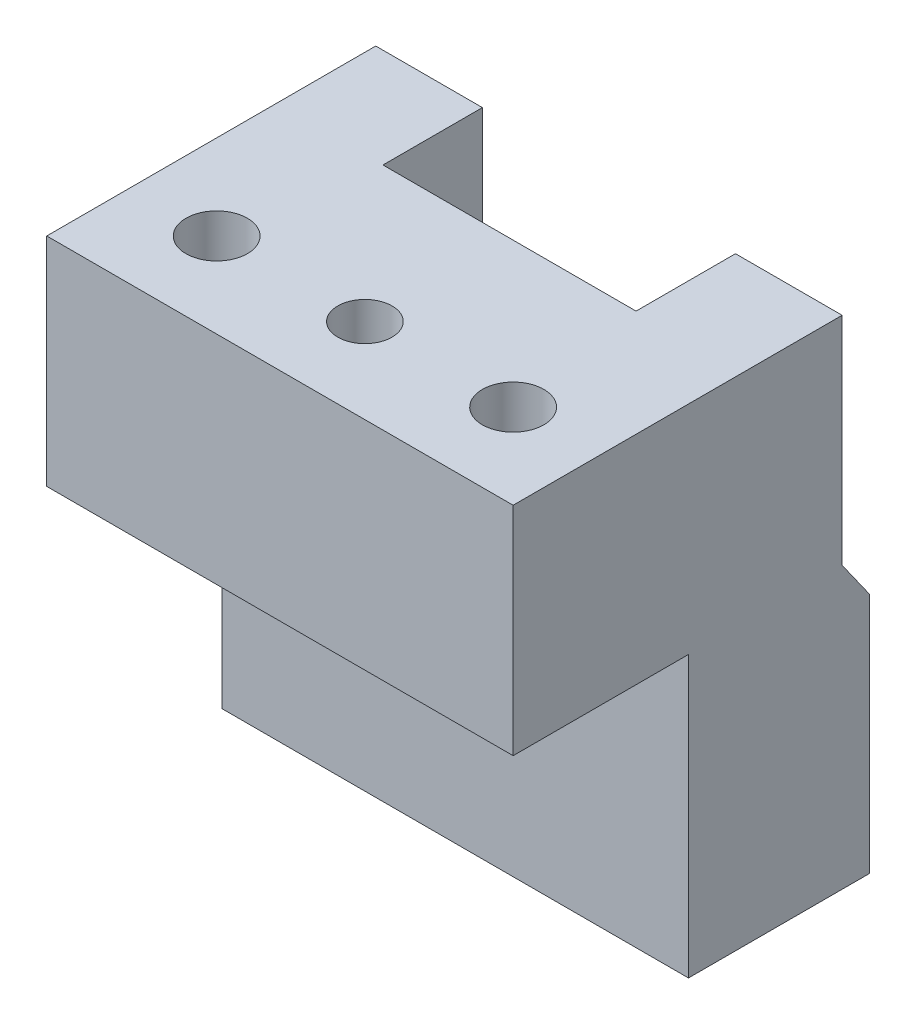
ISO-10303-21;
HEADER;
FILE_DESCRIPTION(('STEP AP214'),'2;1');
FILE_NAME('part.step','',(''),(''),'','','');
FILE_SCHEMA(('AUTOMOTIVE_DESIGN { 1 0 10303 214 1 1 1 1 }'));
ENDSEC;
DATA;
#1=APPLICATION_CONTEXT('core data for automotive mechanical design processes');
#2=APPLICATION_PROTOCOL_DEFINITION('international standard','automotive_design',2000,#1);
#3=PRODUCT_CONTEXT('',#1,'mechanical');
#4=PRODUCT('Part','Part','',(#3));
#5=PRODUCT_RELATED_PRODUCT_CATEGORY('part','',(#4));
#6=PRODUCT_DEFINITION_FORMATION('','',#4);
#7=PRODUCT_DEFINITION_CONTEXT('part definition',#1,'design');
#8=PRODUCT_DEFINITION('design','',#6,#7);
#9=PRODUCT_DEFINITION_SHAPE('','',#8);
#10=(LENGTH_UNIT() NAMED_UNIT(*) SI_UNIT(.MILLI.,.METRE.));
#11=(NAMED_UNIT(*) PLANE_ANGLE_UNIT() SI_UNIT($,.RADIAN.));
#12=(NAMED_UNIT(*) SI_UNIT($,.STERADIAN.) SOLID_ANGLE_UNIT());
#13=UNCERTAINTY_MEASURE_WITH_UNIT(LENGTH_MEASURE(1.E-05),#10,'distance_accuracy_value','');
#14=(GEOMETRIC_REPRESENTATION_CONTEXT(3) GLOBAL_UNCERTAINTY_ASSIGNED_CONTEXT((#13)) GLOBAL_UNIT_ASSIGNED_CONTEXT((#10,
#11,#12)) REPRESENTATION_CONTEXT('',''));
#15=CARTESIAN_POINT('',(0.,0.,0.));
#16=DIRECTION('',(0.,0.,1.));
#17=DIRECTION('',(1.,0.,0.));
#18=AXIS2_PLACEMENT_3D('',#15,#16,#17);
#19=CARTESIAN_POINT('',(0.,0.,0.));
#20=DIRECTION('',(0.,1.,0.));
#21=DIRECTION('',(0.,0.,1.));
#22=AXIS2_PLACEMENT_3D('',#19,#20,#21);
#23=PLANE('',#22);
#24=CARTESIAN_POINT('',(21.1,0.,-4.7));
#25=DIRECTION('',(0.,1.,0.));
#26=DIRECTION('',(0.,0.,1.));
#27=AXIS2_PLACEMENT_3D('',#24,#25,#26);
#28=CIRCLE('',#27,1.7);
#29=CARTESIAN_POINT('',(21.1,0.,-3.));
#30=VERTEX_POINT('',#29);
#31=EDGE_CURVE('E235',#30,#30,#28,.T.);
#32=ORIENTED_EDGE('',*,*,#31,.T.);
#33=EDGE_LOOP('',(#32));
#34=FACE_BOUND('',#33,.T.);
#35=CARTESIAN_POINT('',(12.9,0.,-4.7));
#36=DIRECTION('',(0.,1.,0.));
#37=DIRECTION('',(0.,0.,1.));
#38=AXIS2_PLACEMENT_3D('',#35,#36,#37);
#39=CIRCLE('',#38,1.5);
#40=CARTESIAN_POINT('',(12.9,0.,-3.2));
#41=VERTEX_POINT('',#40);
#42=EDGE_CURVE('E339',#41,#41,#39,.T.);
#43=ORIENTED_EDGE('',*,*,#42,.T.);
#44=EDGE_LOOP('',(#43));
#45=FACE_BOUND('',#44,.T.);
#46=CARTESIAN_POINT('',(4.7,0.,-4.7));
#47=DIRECTION('',(0.,1.,0.));
#48=DIRECTION('',(0.,0.,1.));
#49=AXIS2_PLACEMENT_3D('',#46,#47,#48);
#50=CIRCLE('',#49,1.7);
#51=CARTESIAN_POINT('',(4.7,0.,-3.));
#52=VERTEX_POINT('',#51);
#53=EDGE_CURVE('E333',#52,#52,#50,.T.);
#54=ORIENTED_EDGE('',*,*,#53,.T.);
#55=EDGE_LOOP('',(#54));
#56=FACE_BOUND('',#55,.T.);
#57=DIRECTION('',(-1.,0.,0.));
#58=VECTOR('',#57,1.);
#59=CARTESIAN_POINT('',(25.8,0.,-9.7));
#60=LINE('',#59,#58);
#61=CARTESIAN_POINT('',(25.8,0.,-9.7));
#62=VERTEX_POINT('',#61);
#63=CARTESIAN_POINT('',(0.,0.,-9.7));
#64=VERTEX_POINT('',#63);
#65=EDGE_CURVE('E200',#62,#64,#60,.T.);
#66=ORIENTED_EDGE('',*,*,#65,.F.);
#67=DIRECTION('',(0.,0.,-1.));
#68=VECTOR('',#67,1.);
#69=CARTESIAN_POINT('',(25.8,0.,0.));
#70=LINE('',#69,#68);
#71=CARTESIAN_POINT('',(25.8,0.,0.));
#72=VERTEX_POINT('',#71);
#73=EDGE_CURVE('E225',#72,#62,#70,.T.);
#74=ORIENTED_EDGE('',*,*,#73,.F.);
#75=DIRECTION('',(1.,0.,0.));
#76=VECTOR('',#75,1.);
#77=CARTESIAN_POINT('',(0.,0.,0.));
#78=LINE('',#77,#76);
#79=CARTESIAN_POINT('',(0.,0.,0.));
#80=VERTEX_POINT('',#79);
#81=EDGE_CURVE('E293',#80,#72,#78,.T.);
#82=ORIENTED_EDGE('',*,*,#81,.F.);
#83=DIRECTION('',(0.,0.,1.));
#84=VECTOR('',#83,1.);
#85=CARTESIAN_POINT('',(0.,0.,-18.2));
#86=LINE('',#85,#84);
#87=EDGE_CURVE('E279',#64,#80,#86,.T.);
#88=ORIENTED_EDGE('',*,*,#87,.F.);
#89=EDGE_LOOP('',(#66,#74,#82,#88));
#90=FACE_BOUND('',#89,.T.);
#91=ADVANCED_FACE('F32',(#34,#45,#56,#90),#23,.F.);
#92=CARTESIAN_POINT('',(0.,12.,0.));
#93=DIRECTION('',(0.,1.,0.));
#94=DIRECTION('',(0.,0.,1.));
#95=AXIS2_PLACEMENT_3D('',#92,#93,#94);
#96=PLANE('',#95);
#97=CARTESIAN_POINT('',(12.9,12.,-4.7));
#98=DIRECTION('',(0.,1.,0.));
#99=DIRECTION('',(0.,0.,1.));
#100=AXIS2_PLACEMENT_3D('',#97,#98,#99);
#101=CIRCLE('',#100,1.5);
#102=CARTESIAN_POINT('',(12.9,12.,-3.2));
#103=VERTEX_POINT('',#102);
#104=EDGE_CURVE('E336',#103,#103,#101,.T.);
#105=ORIENTED_EDGE('',*,*,#104,.F.);
#106=EDGE_LOOP('',(#105));
#107=FACE_BOUND('',#106,.T.);
#108=DIRECTION('',(0.,0.,1.));
#109=VECTOR('',#108,1.);
#110=CARTESIAN_POINT('',(0.,12.,-18.2));
#111=LINE('',#110,#109);
#112=CARTESIAN_POINT('',(0.,12.,-18.2));
#113=VERTEX_POINT('',#112);
#114=CARTESIAN_POINT('',(0.,12.,0.));
#115=VERTEX_POINT('',#114);
#116=EDGE_CURVE('E292',#113,#115,#111,.T.);
#117=ORIENTED_EDGE('',*,*,#116,.T.);
#118=DIRECTION('',(1.,0.,0.));
#119=VECTOR('',#118,1.);
#120=CARTESIAN_POINT('',(0.,12.,0.));
#121=LINE('',#120,#119);
#122=CARTESIAN_POINT('',(25.8,12.,0.));
#123=VERTEX_POINT('',#122);
#124=EDGE_CURVE('E295',#115,#123,#121,.T.);
#125=ORIENTED_EDGE('',*,*,#124,.T.);
#126=DIRECTION('',(0.,0.,-1.));
#127=VECTOR('',#126,1.);
#128=CARTESIAN_POINT('',(25.8,12.,0.));
#129=LINE('',#128,#127);
#130=CARTESIAN_POINT('',(25.8,12.,-18.2));
#131=VERTEX_POINT('',#130);
#132=EDGE_CURVE('E330',#123,#131,#129,.T.);
#133=ORIENTED_EDGE('',*,*,#132,.T.);
#134=DIRECTION('',(-1.,0.,0.));
#135=VECTOR('',#134,1.);
#136=CARTESIAN_POINT('',(19.9,12.,-18.2));
#137=LINE('',#136,#135);
#138=CARTESIAN_POINT('',(19.9,12.,-18.2));
#139=VERTEX_POINT('',#138);
#140=EDGE_CURVE('E328',#131,#139,#137,.T.);
#141=ORIENTED_EDGE('',*,*,#140,.T.);
#142=DIRECTION('',(0.,0.,1.));
#143=VECTOR('',#142,1.);
#144=CARTESIAN_POINT('',(19.9,12.,-18.2));
#145=LINE('',#144,#143);
#146=CARTESIAN_POINT('',(19.9,12.,-12.7));
#147=VERTEX_POINT('',#146);
#148=EDGE_CURVE('E326',#139,#147,#145,.T.);
#149=ORIENTED_EDGE('',*,*,#148,.T.);
#150=DIRECTION('',(-1.,0.,0.));
#151=VECTOR('',#150,1.);
#152=CARTESIAN_POINT('',(19.9,12.,-12.7));
#153=LINE('',#152,#151);
#154=CARTESIAN_POINT('',(5.9,12.,-12.7));
#155=VERTEX_POINT('',#154);
#156=EDGE_CURVE('E322',#147,#155,#153,.T.);
#157=ORIENTED_EDGE('',*,*,#156,.T.);
#158=DIRECTION('',(0.,0.,-1.));
#159=VECTOR('',#158,1.);
#160=CARTESIAN_POINT('',(5.9,12.,-12.7));
#161=LINE('',#160,#159);
#162=CARTESIAN_POINT('',(5.9,12.,-18.2));
#163=VERTEX_POINT('',#162);
#164=EDGE_CURVE('E321',#155,#163,#161,.T.);
#165=ORIENTED_EDGE('',*,*,#164,.T.);
#166=DIRECTION('',(-1.,0.,0.));
#167=VECTOR('',#166,1.);
#168=CARTESIAN_POINT('',(0.,12.,-18.2));
#169=LINE('',#168,#167);
#170=EDGE_CURVE('E256',#163,#113,#169,.T.);
#171=ORIENTED_EDGE('',*,*,#170,.T.);
#172=EDGE_LOOP('',(#117,#125,#133,#141,#149,#157,#165,#171));
#173=FACE_BOUND('',#172,.T.);
#174=CARTESIAN_POINT('',(4.7,12.,-4.7));
#175=DIRECTION('',(0.,1.,0.));
#176=DIRECTION('',(0.,0.,1.));
#177=AXIS2_PLACEMENT_3D('',#174,#175,#176);
#178=CIRCLE('',#177,1.7);
#179=CARTESIAN_POINT('',(4.7,12.,-3.));
#180=VERTEX_POINT('',#179);
#181=EDGE_CURVE('E300',#180,#180,#178,.T.);
#182=ORIENTED_EDGE('',*,*,#181,.F.);
#183=EDGE_LOOP('',(#182));
#184=FACE_BOUND('',#183,.T.);
#185=CARTESIAN_POINT('',(21.1,12.,-4.7));
#186=DIRECTION('',(0.,1.,0.));
#187=DIRECTION('',(0.,0.,1.));
#188=AXIS2_PLACEMENT_3D('',#185,#186,#187);
#189=CIRCLE('',#188,1.7);
#190=CARTESIAN_POINT('',(21.1,12.,-3.));
#191=VERTEX_POINT('',#190);
#192=EDGE_CURVE('E219',#191,#191,#189,.T.);
#193=ORIENTED_EDGE('',*,*,#192,.F.);
#194=EDGE_LOOP('',(#193));
#195=FACE_BOUND('',#194,.T.);
#196=ADVANCED_FACE('F319',(#107,#173,#184,#195),#96,.T.);
#197=CARTESIAN_POINT('',(0.,12.,-18.2));
#198=DIRECTION('',(1.,0.,0.));
#199=DIRECTION('',(0.,0.,-1.));
#200=AXIS2_PLACEMENT_3D('',#197,#198,#199);
#201=PLANE('',#200);
#202=DIRECTION('',(0.,-1.,0.));
#203=VECTOR('',#202,1.);
#204=CARTESIAN_POINT('',(0.,12.,-18.2));
#205=LINE('',#204,#203);
#206=CARTESIAN_POINT('',(0.,0.0213203435597605,-18.2));
#207=VERTEX_POINT('',#206);
#208=EDGE_CURVE('E258',#113,#207,#205,.T.);
#209=ORIENTED_EDGE('',*,*,#208,.T.);
#210=DIRECTION('',(0.,-0.816496580927723,-0.57735026918963));
#211=VECTOR('',#210,1.);
#212=CARTESIAN_POINT('',(0.,8.00710678118654,-12.5531962568465));
#213=LINE('',#212,#211);
#214=CARTESIAN_POINT('',(0.,-2.09999999999989,-19.7));
#215=VERTEX_POINT('',#214);
#216=EDGE_CURVE('E11',#207,#215,#213,.T.);
#217=ORIENTED_EDGE('',*,*,#216,.T.);
#218=DIRECTION('',(0.,-1.,0.));
#219=VECTOR('',#218,1.);
#220=CARTESIAN_POINT('',(0.,-12.5,-19.7));
#221=LINE('',#220,#219);
#222=CARTESIAN_POINT('',(0.,-15.5,-19.7));
#223=VERTEX_POINT('',#222);
#224=EDGE_CURVE('E181',#215,#223,#221,.T.);
#225=ORIENTED_EDGE('',*,*,#224,.T.);
#226=DIRECTION('',(0.,0.,-1.));
#227=VECTOR('',#226,1.);
#228=CARTESIAN_POINT('',(0.,-15.5,-9.7));
#229=LINE('',#228,#227);
#230=CARTESIAN_POINT('',(0.,-15.5,-9.7));
#231=VERTEX_POINT('',#230);
#232=EDGE_CURVE('E205',#231,#223,#229,.T.);
#233=ORIENTED_EDGE('',*,*,#232,.F.);
#234=DIRECTION('',(0.,1.,0.));
#235=VECTOR('',#234,1.);
#236=CARTESIAN_POINT('',(0.,-15.5,-9.7));
#237=LINE('',#236,#235);
#238=EDGE_CURVE('E216',#231,#64,#237,.T.);
#239=ORIENTED_EDGE('',*,*,#238,.T.);
#240=ORIENTED_EDGE('',*,*,#87,.T.);
#241=DIRECTION('',(0.,-1.,0.));
#242=VECTOR('',#241,1.);
#243=CARTESIAN_POINT('',(0.,12.,0.));
#244=LINE('',#243,#242);
#245=EDGE_CURVE('E240',#115,#80,#244,.T.);
#246=ORIENTED_EDGE('',*,*,#245,.F.);
#247=ORIENTED_EDGE('',*,*,#116,.F.);
#248=EDGE_LOOP('',(#209,#217,#225,#233,#239,#240,#246,#247));
#249=FACE_BOUND('',#248,.T.);
#250=ADVANCED_FACE('F264',(#249),#201,.F.);
#251=CARTESIAN_POINT('',(0.,12.,0.));
#252=DIRECTION('',(0.,0.,-1.));
#253=DIRECTION('',(-1.,0.,0.));
#254=AXIS2_PLACEMENT_3D('',#251,#252,#253);
#255=PLANE('',#254);
#256=ORIENTED_EDGE('',*,*,#81,.T.);
#257=DIRECTION('',(0.,-1.,0.));
#258=VECTOR('',#257,1.);
#259=CARTESIAN_POINT('',(25.8,12.,0.));
#260=LINE('',#259,#258);
#261=EDGE_CURVE('E291',#123,#72,#260,.T.);
#262=ORIENTED_EDGE('',*,*,#261,.F.);
#263=ORIENTED_EDGE('',*,*,#124,.F.);
#264=ORIENTED_EDGE('',*,*,#245,.T.);
#265=EDGE_LOOP('',(#256,#262,#263,#264));
#266=FACE_BOUND('',#265,.T.);
#267=ADVANCED_FACE('F317',(#266),#255,.F.);
#268=CARTESIAN_POINT('',(25.8,12.,0.));
#269=DIRECTION('',(-1.,0.,0.));
#270=DIRECTION('',(0.,0.,1.));
#271=AXIS2_PLACEMENT_3D('',#268,#269,#270);
#272=PLANE('',#271);
#273=ORIENTED_EDGE('',*,*,#73,.T.);
#274=DIRECTION('',(0.,1.,0.));
#275=VECTOR('',#274,1.);
#276=CARTESIAN_POINT('',(25.8,-15.5,-9.7));
#277=LINE('',#276,#275);
#278=CARTESIAN_POINT('',(25.8,-15.5,-9.7));
#279=VERTEX_POINT('',#278);
#280=EDGE_CURVE('E230',#279,#62,#277,.T.);
#281=ORIENTED_EDGE('',*,*,#280,.F.);
#282=DIRECTION('',(0.,0.,1.));
#283=VECTOR('',#282,1.);
#284=CARTESIAN_POINT('',(25.8,-15.5,-18.2));
#285=LINE('',#284,#283);
#286=CARTESIAN_POINT('',(25.8,-15.5,-19.7));
#287=VERTEX_POINT('',#286);
#288=EDGE_CURVE('E201',#287,#279,#285,.T.);
#289=ORIENTED_EDGE('',*,*,#288,.F.);
#290=DIRECTION('',(0.,-1.,0.));
#291=VECTOR('',#290,1.);
#292=CARTESIAN_POINT('',(25.8,-12.5,-19.7));
#293=LINE('',#292,#291);
#294=CARTESIAN_POINT('',(25.8,-2.09999999999989,-19.7));
#295=VERTEX_POINT('',#294);
#296=EDGE_CURVE('E191',#295,#287,#293,.T.);
#297=ORIENTED_EDGE('',*,*,#296,.F.);
#298=DIRECTION('',(0.,0.816496580927724,0.577350269189629));
#299=VECTOR('',#298,1.);
#300=CARTESIAN_POINT('',(25.8,16.5866690595833,-6.48652959017977));
#301=LINE('',#300,#299);
#302=CARTESIAN_POINT('',(25.8,0.0213203435597657,-18.2));
#303=VERTEX_POINT('',#302);
#304=EDGE_CURVE('E244',#295,#303,#301,.T.);
#305=ORIENTED_EDGE('',*,*,#304,.T.);
#306=DIRECTION('',(0.,-1.,0.));
#307=VECTOR('',#306,1.);
#308=CARTESIAN_POINT('',(25.8,12.,-18.2));
#309=LINE('',#308,#307);
#310=EDGE_CURVE('E313',#131,#303,#309,.T.);
#311=ORIENTED_EDGE('',*,*,#310,.F.);
#312=ORIENTED_EDGE('',*,*,#132,.F.);
#313=ORIENTED_EDGE('',*,*,#261,.T.);
#314=EDGE_LOOP('',(#273,#281,#289,#297,#305,#311,#312,#313));
#315=FACE_BOUND('',#314,.T.);
#316=ADVANCED_FACE('F288',(#315),#272,.F.);
#317=CARTESIAN_POINT('',(19.9,12.,-18.2));
#318=DIRECTION('',(0.,0.,1.));
#319=DIRECTION('',(1.,0.,0.));
#320=AXIS2_PLACEMENT_3D('',#317,#318,#319);
#321=PLANE('',#320);
#322=ORIENTED_EDGE('',*,*,#310,.T.);
#323=DIRECTION('',(-0.707106781186544,-0.707106781186551,0.));
#324=VECTOR('',#323,1.);
#325=CARTESIAN_POINT('',(28.8393398282202,3.06066017177994,-18.2));
#326=LINE('',#325,#324);
#327=CARTESIAN_POINT('',(19.9,-5.87867965644031,-18.2));
#328=VERTEX_POINT('',#327);
#329=EDGE_CURVE('E239',#303,#328,#326,.T.);
#330=ORIENTED_EDGE('',*,*,#329,.T.);
#331=DIRECTION('',(0.,-1.,0.));
#332=VECTOR('',#331,1.);
#333=CARTESIAN_POINT('',(19.9,12.,-18.2));
#334=LINE('',#333,#332);
#335=EDGE_CURVE('E310',#139,#328,#334,.T.);
#336=ORIENTED_EDGE('',*,*,#335,.F.);
#337=ORIENTED_EDGE('',*,*,#140,.F.);
#338=EDGE_LOOP('',(#322,#330,#336,#337));
#339=FACE_BOUND('',#338,.T.);
#340=ADVANCED_FACE('F377',(#339),#321,.F.);
#341=CARTESIAN_POINT('',(19.9,12.,-18.2));
#342=DIRECTION('',(1.,0.,0.));
#343=DIRECTION('',(0.,0.,-1.));
#344=AXIS2_PLACEMENT_3D('',#341,#342,#343);
#345=PLANE('',#344);
#346=ORIENTED_EDGE('',*,*,#335,.T.);
#347=DIRECTION('',(0.,-0.816496580927724,-0.577350269189629));
#348=VECTOR('',#347,1.);
#349=CARTESIAN_POINT('',(19.9,6.04044011451984,-9.77190958417937));
#350=LINE('',#349,#348);
#351=CARTESIAN_POINT('',(19.9,-7.99999999999996,-19.7));
#352=VERTEX_POINT('',#351);
#353=EDGE_CURVE('E246',#328,#352,#350,.T.);
#354=ORIENTED_EDGE('',*,*,#353,.T.);
#355=DIRECTION('',(0.,0.,-1.));
#356=VECTOR('',#355,1.);
#357=CARTESIAN_POINT('',(19.9,-7.99999999999995,-3.49217895131971));
#358=LINE('',#357,#356);
#359=CARTESIAN_POINT('',(19.9,-7.99999999999995,-18.2));
#360=VERTEX_POINT('',#359);
#361=EDGE_CURVE('E47',#360,#352,#358,.T.);
#362=ORIENTED_EDGE('',*,*,#361,.F.);
#363=DIRECTION('',(0.,-1.,0.));
#364=VECTOR('',#363,1.);
#365=CARTESIAN_POINT('',(19.9,12.,-18.2));
#366=LINE('',#365,#364);
#367=CARTESIAN_POINT('',(19.9,-15.5,-18.2));
#368=VERTEX_POINT('',#367);
#369=EDGE_CURVE('E198',#360,#368,#366,.T.);
#370=ORIENTED_EDGE('',*,*,#369,.T.);
#371=DIRECTION('',(0.,0.,-1.));
#372=VECTOR('',#371,1.);
#373=CARTESIAN_POINT('',(19.9,-15.5,-18.2));
#374=LINE('',#373,#372);
#375=CARTESIAN_POINT('',(19.9,-15.5,-12.7));
#376=VERTEX_POINT('',#375);
#377=EDGE_CURVE('E213',#376,#368,#374,.T.);
#378=ORIENTED_EDGE('',*,*,#377,.F.);
#379=DIRECTION('',(0.,-1.,0.));
#380=VECTOR('',#379,1.);
#381=CARTESIAN_POINT('',(19.9,12.,-12.7));
#382=LINE('',#381,#380);
#383=EDGE_CURVE('E308',#147,#376,#382,.T.);
#384=ORIENTED_EDGE('',*,*,#383,.F.);
#385=ORIENTED_EDGE('',*,*,#148,.F.);
#386=EDGE_LOOP('',(#346,#354,#362,#370,#378,#384,#385));
#387=FACE_BOUND('',#386,.T.);
#388=ADVANCED_FACE('F373',(#387),#345,.F.);
#389=CARTESIAN_POINT('',(19.9,12.,-12.7));
#390=DIRECTION('',(0.,0.,1.));
#391=DIRECTION('',(1.,0.,0.));
#392=AXIS2_PLACEMENT_3D('',#389,#390,#391);
#393=PLANE('',#392);
#394=ORIENTED_EDGE('',*,*,#383,.T.);
#395=DIRECTION('',(1.,0.,0.));
#396=VECTOR('',#395,1.);
#397=CARTESIAN_POINT('',(19.9,-15.5,-12.7));
#398=LINE('',#397,#396);
#399=CARTESIAN_POINT('',(5.9,-15.5,-12.7));
#400=VERTEX_POINT('',#399);
#401=EDGE_CURVE('E210',#400,#376,#398,.T.);
#402=ORIENTED_EDGE('',*,*,#401,.F.);
#403=DIRECTION('',(0.,-1.,0.));
#404=VECTOR('',#403,1.);
#405=CARTESIAN_POINT('',(5.9,12.,-12.7));
#406=LINE('',#405,#404);
#407=EDGE_CURVE('E257',#155,#400,#406,.T.);
#408=ORIENTED_EDGE('',*,*,#407,.F.);
#409=ORIENTED_EDGE('',*,*,#156,.F.);
#410=EDGE_LOOP('',(#394,#402,#408,#409));
#411=FACE_BOUND('',#410,.T.);
#412=ADVANCED_FACE('F370',(#411),#393,.F.);
#413=CARTESIAN_POINT('',(5.9,12.,-12.7));
#414=DIRECTION('',(-1.,0.,0.));
#415=DIRECTION('',(0.,0.,1.));
#416=AXIS2_PLACEMENT_3D('',#413,#414,#415);
#417=PLANE('',#416);
#418=ORIENTED_EDGE('',*,*,#407,.T.);
#419=DIRECTION('',(0.,0.,1.));
#420=VECTOR('',#419,1.);
#421=CARTESIAN_POINT('',(5.9,-15.5,-12.7));
#422=LINE('',#421,#420);
#423=CARTESIAN_POINT('',(5.9,-15.5,-18.2));
#424=VERTEX_POINT('',#423);
#425=EDGE_CURVE('E207',#424,#400,#422,.T.);
#426=ORIENTED_EDGE('',*,*,#425,.F.);
#427=DIRECTION('',(0.,1.,0.));
#428=VECTOR('',#427,1.);
#429=CARTESIAN_POINT('',(5.9,12.,-18.2));
#430=LINE('',#429,#428);
#431=CARTESIAN_POINT('',(5.90000000000001,-7.99999999999996,-18.2));
#432=VERTEX_POINT('',#431);
#433=EDGE_CURVE('E194',#424,#432,#430,.T.);
#434=ORIENTED_EDGE('',*,*,#433,.T.);
#435=DIRECTION('',(0.,0.,1.));
#436=VECTOR('',#435,1.);
#437=CARTESIAN_POINT('',(5.9,-7.99999999999995,-3.49217895131972));
#438=LINE('',#437,#436);
#439=CARTESIAN_POINT('',(5.90000000000001,-7.99999999999995,-19.7));
#440=VERTEX_POINT('',#439);
#441=EDGE_CURVE('E160',#440,#432,#438,.T.);
#442=ORIENTED_EDGE('',*,*,#441,.F.);
#443=DIRECTION('',(0.,0.816496580927723,0.57735026918963));
#444=VECTOR('',#443,1.);
#445=CARTESIAN_POINT('',(5.9,8.6331649788705,-7.938576250846));
#446=LINE('',#445,#444);
#447=CARTESIAN_POINT('',(5.9,-5.87867965644031,-18.2));
#448=VERTEX_POINT('',#447);
#449=EDGE_CURVE('E40',#440,#448,#446,.T.);
#450=ORIENTED_EDGE('',*,*,#449,.T.);
#451=DIRECTION('',(0.,-1.,0.));
#452=VECTOR('',#451,1.);
#453=CARTESIAN_POINT('',(5.9,12.,-18.2));
#454=LINE('',#453,#452);
#455=EDGE_CURVE('E251',#163,#448,#454,.T.);
#456=ORIENTED_EDGE('',*,*,#455,.F.);
#457=ORIENTED_EDGE('',*,*,#164,.F.);
#458=EDGE_LOOP('',(#418,#426,#434,#442,#450,#456,#457));
#459=FACE_BOUND('',#458,.T.);
#460=ADVANCED_FACE('F249',(#459),#417,.F.);
#461=CARTESIAN_POINT('',(0.,12.,-18.2));
#462=DIRECTION('',(0.,0.,1.));
#463=DIRECTION('',(1.,0.,0.));
#464=AXIS2_PLACEMENT_3D('',#461,#462,#463);
#465=PLANE('',#464);
#466=ORIENTED_EDGE('',*,*,#455,.T.);
#467=DIRECTION('',(-0.707106781186544,0.707106781186551,0.));
#468=VECTOR('',#467,1.);
#469=CARTESIAN_POINT('',(-5.98933982822012,6.01066017177994,-18.2));
#470=LINE('',#469,#468);
#471=EDGE_CURVE('E55',#448,#207,#470,.T.);
#472=ORIENTED_EDGE('',*,*,#471,.T.);
#473=ORIENTED_EDGE('',*,*,#208,.F.);
#474=ORIENTED_EDGE('',*,*,#170,.F.);
#475=EDGE_LOOP('',(#466,#472,#473,#474));
#476=FACE_BOUND('',#475,.T.);
#477=ADVANCED_FACE('F255',(#476),#465,.F.);
#478=CARTESIAN_POINT('',(4.7,12.,-4.7));
#479=DIRECTION('',(0.,-1.,0.));
#480=DIRECTION('',(0.,0.,-1.));
#481=AXIS2_PLACEMENT_3D('',#478,#479,#480);
#482=CYLINDRICAL_SURFACE('',#481,1.7);
#483=ORIENTED_EDGE('',*,*,#181,.T.);
#484=EDGE_LOOP('',(#483));
#485=FACE_BOUND('',#484,.T.);
#486=ORIENTED_EDGE('',*,*,#53,.F.);
#487=EDGE_LOOP('',(#486));
#488=FACE_BOUND('',#487,.T.);
#489=ADVANCED_FACE('F363',(#485,#488),#482,.F.);
#490=CARTESIAN_POINT('',(12.9,12.,-4.7));
#491=DIRECTION('',(0.,-1.,0.));
#492=DIRECTION('',(0.,0.,-1.));
#493=AXIS2_PLACEMENT_3D('',#490,#491,#492);
#494=CYLINDRICAL_SURFACE('',#493,1.5);
#495=ORIENTED_EDGE('',*,*,#104,.T.);
#496=EDGE_LOOP('',(#495));
#497=FACE_BOUND('',#496,.T.);
#498=ORIENTED_EDGE('',*,*,#42,.F.);
#499=EDGE_LOOP('',(#498));
#500=FACE_BOUND('',#499,.T.);
#501=ADVANCED_FACE('F424',(#497,#500),#494,.F.);
#502=CARTESIAN_POINT('',(21.1,12.,-4.7));
#503=DIRECTION('',(0.,-1.,0.));
#504=DIRECTION('',(0.,0.,-1.));
#505=AXIS2_PLACEMENT_3D('',#502,#503,#504);
#506=CYLINDRICAL_SURFACE('',#505,1.7);
#507=ORIENTED_EDGE('',*,*,#192,.T.);
#508=EDGE_LOOP('',(#507));
#509=FACE_BOUND('',#508,.T.);
#510=ORIENTED_EDGE('',*,*,#31,.F.);
#511=EDGE_LOOP('',(#510));
#512=FACE_BOUND('',#511,.T.);
#513=ADVANCED_FACE('F349',(#509,#512),#506,.F.);
#514=CARTESIAN_POINT('',(25.8,-15.5,-9.7));
#515=DIRECTION('',(0.,0.,-1.));
#516=DIRECTION('',(-1.,0.,0.));
#517=AXIS2_PLACEMENT_3D('',#514,#515,#516);
#518=PLANE('',#517);
#519=ORIENTED_EDGE('',*,*,#65,.T.);
#520=ORIENTED_EDGE('',*,*,#238,.F.);
#521=DIRECTION('',(-1.,0.,0.));
#522=VECTOR('',#521,1.);
#523=CARTESIAN_POINT('',(25.8,-15.5,-9.7));
#524=LINE('',#523,#522);
#525=EDGE_CURVE('E203',#279,#231,#524,.T.);
#526=ORIENTED_EDGE('',*,*,#525,.F.);
#527=ORIENTED_EDGE('',*,*,#280,.T.);
#528=EDGE_LOOP('',(#519,#520,#526,#527));
#529=FACE_BOUND('',#528,.T.);
#530=ADVANCED_FACE('F282',(#529),#518,.F.);
#531=CARTESIAN_POINT('',(0.,-15.5,0.));
#532=DIRECTION('',(0.,-1.,0.));
#533=DIRECTION('',(0.,0.,-1.));
#534=AXIS2_PLACEMENT_3D('',#531,#532,#533);
#535=PLANE('',#534);
#536=DIRECTION('',(1.,0.,0.));
#537=VECTOR('',#536,1.);
#538=CARTESIAN_POINT('',(25.8,-15.5,-19.7));
#539=LINE('',#538,#537);
#540=EDGE_CURVE('E179',#223,#287,#539,.T.);
#541=ORIENTED_EDGE('',*,*,#540,.T.);
#542=ORIENTED_EDGE('',*,*,#288,.T.);
#543=ORIENTED_EDGE('',*,*,#525,.T.);
#544=ORIENTED_EDGE('',*,*,#232,.T.);
#545=EDGE_LOOP('',(#541,#542,#543,#544));
#546=FACE_BOUND('',#545,.T.);
#547=ORIENTED_EDGE('',*,*,#377,.T.);
#548=DIRECTION('',(-1.,0.,0.));
#549=VECTOR('',#548,1.);
#550=CARTESIAN_POINT('',(25.8,-15.5,-18.2));
#551=LINE('',#550,#549);
#552=EDGE_CURVE('E184',#368,#424,#551,.T.);
#553=ORIENTED_EDGE('',*,*,#552,.T.);
#554=ORIENTED_EDGE('',*,*,#425,.T.);
#555=ORIENTED_EDGE('',*,*,#401,.T.);
#556=EDGE_LOOP('',(#547,#553,#554,#555));
#557=FACE_BOUND('',#556,.T.);
#558=ADVANCED_FACE('F273',(#546,#557),#535,.T.);
#559=CARTESIAN_POINT('',(25.8,-12.5,-18.2));
#560=DIRECTION('',(0.,0.,1.));
#561=DIRECTION('',(1.,0.,0.));
#562=AXIS2_PLACEMENT_3D('',#559,#560,#561);
#563=PLANE('',#562);
#564=ORIENTED_EDGE('',*,*,#369,.F.);
#565=DIRECTION('',(0.707106781186544,0.707106781186551,0.));
#566=VECTOR('',#565,1.);
#567=CARTESIAN_POINT('',(25.8,-2.09999999999989,-18.2));
#568=LINE('',#567,#566);
#569=CARTESIAN_POINT('',(15.4,-12.5,-18.2));
#570=VERTEX_POINT('',#569);
#571=EDGE_CURVE('E177',#570,#360,#568,.T.);
#572=ORIENTED_EDGE('',*,*,#571,.F.);
#573=DIRECTION('',(-1.,0.,0.));
#574=VECTOR('',#573,1.);
#575=CARTESIAN_POINT('',(25.8,-12.5,-18.2));
#576=LINE('',#575,#574);
#577=CARTESIAN_POINT('',(10.4,-12.5,-18.2));
#578=VERTEX_POINT('',#577);
#579=EDGE_CURVE('E171',#570,#578,#576,.T.);
#580=ORIENTED_EDGE('',*,*,#579,.T.);
#581=DIRECTION('',(0.707106781186544,-0.707106781186551,0.));
#582=VECTOR('',#581,1.);
#583=CARTESIAN_POINT('',(10.4,-12.5,-18.2));
#584=LINE('',#583,#582);
#585=EDGE_CURVE('E153',#432,#578,#584,.T.);
#586=ORIENTED_EDGE('',*,*,#585,.F.);
#587=ORIENTED_EDGE('',*,*,#433,.F.);
#588=ORIENTED_EDGE('',*,*,#552,.F.);
#589=EDGE_LOOP('',(#564,#572,#580,#586,#587,#588));
#590=FACE_BOUND('',#589,.T.);
#591=ADVANCED_FACE('F176',(#590),#563,.T.);
#592=CARTESIAN_POINT('',(25.8,-12.5,-19.7));
#593=DIRECTION('',(0.,0.,-1.));
#594=DIRECTION('',(-1.,0.,0.));
#595=AXIS2_PLACEMENT_3D('',#592,#593,#594);
#596=PLANE('',#595);
#597=ORIENTED_EDGE('',*,*,#540,.F.);
#598=ORIENTED_EDGE('',*,*,#224,.F.);
#599=DIRECTION('',(0.707106781186544,-0.707106781186551,0.));
#600=VECTOR('',#599,1.);
#601=CARTESIAN_POINT('',(10.4,-12.5,-19.7));
#602=LINE('',#601,#600);
#603=EDGE_CURVE('E165',#215,#440,#602,.T.);
#604=ORIENTED_EDGE('',*,*,#603,.T.);
#605=CARTESIAN_POINT('',(10.4,-12.5,-19.7));
#606=VERTEX_POINT('',#605);
#607=EDGE_CURVE('E404',#440,#606,#602,.T.);
#608=ORIENTED_EDGE('',*,*,#607,.T.);
#609=DIRECTION('',(1.,0.,0.));
#610=VECTOR('',#609,1.);
#611=CARTESIAN_POINT('',(25.8,-12.5,-19.7));
#612=LINE('',#611,#610);
#613=CARTESIAN_POINT('',(15.4,-12.5,-19.7));
#614=VERTEX_POINT('',#613);
#615=EDGE_CURVE('E172',#606,#614,#612,.T.);
#616=ORIENTED_EDGE('',*,*,#615,.T.);
#617=DIRECTION('',(0.707106781186544,0.707106781186551,0.));
#618=VECTOR('',#617,1.);
#619=CARTESIAN_POINT('',(25.8,-2.09999999999989,-19.7));
#620=LINE('',#619,#618);
#621=EDGE_CURVE('E401',#614,#352,#620,.T.);
#622=ORIENTED_EDGE('',*,*,#621,.T.);
#623=EDGE_CURVE('E173',#352,#295,#620,.T.);
#624=ORIENTED_EDGE('',*,*,#623,.T.);
#625=ORIENTED_EDGE('',*,*,#296,.T.);
#626=EDGE_LOOP('',(#597,#598,#604,#608,#616,#622,#624,#625));
#627=FACE_BOUND('',#626,.T.);
#628=ADVANCED_FACE('F269',(#627),#596,.T.);
#629=CARTESIAN_POINT('',(0.,-12.5,0.));
#630=DIRECTION('',(0.,1.,0.));
#631=DIRECTION('',(0.,0.,1.));
#632=AXIS2_PLACEMENT_3D('',#629,#630,#631);
#633=PLANE('',#632);
#634=DIRECTION('',(0.,0.,-1.));
#635=VECTOR('',#634,1.);
#636=CARTESIAN_POINT('',(10.4,-12.5,-3.49217895131972));
#637=LINE('',#636,#635);
#638=EDGE_CURVE('E157',#578,#606,#637,.T.);
#639=ORIENTED_EDGE('',*,*,#638,.F.);
#640=ORIENTED_EDGE('',*,*,#579,.F.);
#641=DIRECTION('',(0.,0.,-1.));
#642=VECTOR('',#641,1.);
#643=CARTESIAN_POINT('',(15.4,-12.5,-3.49217895131971));
#644=LINE('',#643,#642);
#645=EDGE_CURVE('E187',#570,#614,#644,.T.);
#646=ORIENTED_EDGE('',*,*,#645,.T.);
#647=ORIENTED_EDGE('',*,*,#615,.F.);
#648=EDGE_LOOP('',(#639,#640,#646,#647));
#649=FACE_BOUND('',#648,.T.);
#650=ADVANCED_FACE('F169',(#649),#633,.T.);
#651=CARTESIAN_POINT('',(25.8,-2.09999999999989,-3.49217895131971));
#652=DIRECTION('',(-0.707106781186551,0.707106781186544,0.));
#653=DIRECTION('',(-0.707106781186544,-0.707106781186551,0.));
#654=AXIS2_PLACEMENT_3D('',#651,#652,#653);
#655=PLANE('',#654);
#656=ORIENTED_EDGE('',*,*,#571,.T.);
#657=ORIENTED_EDGE('',*,*,#361,.T.);
#658=ORIENTED_EDGE('',*,*,#621,.F.);
#659=ORIENTED_EDGE('',*,*,#645,.F.);
#660=EDGE_LOOP('',(#656,#657,#658,#659));
#661=FACE_BOUND('',#660,.T.);
#662=ADVANCED_FACE('F391',(#661),#655,.T.);
#663=CARTESIAN_POINT('',(10.4,-12.5,-3.49217895131972));
#664=DIRECTION('',(0.707106781186551,0.707106781186544,0.));
#665=DIRECTION('',(-0.707106781186544,0.707106781186551,0.));
#666=AXIS2_PLACEMENT_3D('',#663,#664,#665);
#667=PLANE('',#666);
#668=ORIENTED_EDGE('',*,*,#607,.F.);
#669=ORIENTED_EDGE('',*,*,#441,.T.);
#670=ORIENTED_EDGE('',*,*,#585,.T.);
#671=ORIENTED_EDGE('',*,*,#638,.T.);
#672=EDGE_LOOP('',(#668,#669,#670,#671));
#673=FACE_BOUND('',#672,.T.);
#674=ADVANCED_FACE('F156',(#673),#667,.T.);
#675=CARTESIAN_POINT('',(25.8,-2.09999999999989,-19.7));
#676=DIRECTION('',(0.500000000000006,-0.500000000000001,0.707106781186543));
#677=DIRECTION('',(0.707106781186544,0.707106781186551,0.));
#678=AXIS2_PLACEMENT_3D('',#675,#676,#677);
#679=PLANE('',#678);
#680=ORIENTED_EDGE('',*,*,#353,.F.);
#681=ORIENTED_EDGE('',*,*,#329,.F.);
#682=ORIENTED_EDGE('',*,*,#304,.F.);
#683=ORIENTED_EDGE('',*,*,#623,.F.);
#684=EDGE_LOOP('',(#680,#681,#682,#683));
#685=FACE_BOUND('',#684,.T.);
#686=ADVANCED_FACE('F384',(#685),#679,.F.);
#687=CARTESIAN_POINT('',(10.4,-12.5,-19.7));
#688=DIRECTION('',(-0.500000000000006,-0.500000000000001,0.707106781186542));
#689=DIRECTION('',(0.707106781186544,-0.707106781186551,0.));
#690=AXIS2_PLACEMENT_3D('',#687,#688,#689);
#691=PLANE('',#690);
#692=ORIENTED_EDGE('',*,*,#216,.F.);
#693=ORIENTED_EDGE('',*,*,#471,.F.);
#694=ORIENTED_EDGE('',*,*,#449,.F.);
#695=ORIENTED_EDGE('',*,*,#603,.F.);
#696=EDGE_LOOP('',(#692,#693,#694,#695));
#697=FACE_BOUND('',#696,.T.);
#698=ADVANCED_FACE('F34',(#697),#691,.F.);
#699=CLOSED_SHELL('',(#91,#196,#250,#267,#316,#340,#388,#412,#460,#477,#489,#501,#513,#530,#558,
#591,#628,#650,#662,#674,#686,#698));
#700=MANIFOLD_SOLID_BREP('B2',#699);
#701=ADVANCED_BREP_SHAPE_REPRESENTATION('',(#18,#700),#14);
#702=SHAPE_DEFINITION_REPRESENTATION(#9,#701);
ENDSEC;
END-ISO-10303-21;
